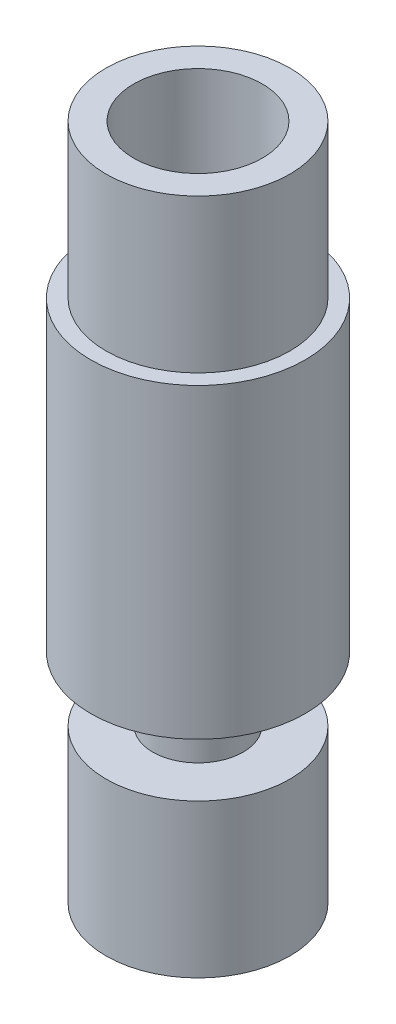
ISO-10303-21;
HEADER;
FILE_DESCRIPTION(('STEP AP214'),'2;1');
FILE_NAME('part.step','',(''),(''),'','','');
FILE_SCHEMA(('AUTOMOTIVE_DESIGN { 1 0 10303 214 1 1 1 1 }'));
ENDSEC;
DATA;
#1=APPLICATION_CONTEXT('core data for automotive mechanical design processes');
#2=APPLICATION_PROTOCOL_DEFINITION('international standard','automotive_design',2000,#1);
#3=PRODUCT_CONTEXT('',#1,'mechanical');
#4=PRODUCT('Part','Part','',(#3));
#5=PRODUCT_RELATED_PRODUCT_CATEGORY('part','',(#4));
#6=PRODUCT_DEFINITION_FORMATION('','',#4);
#7=PRODUCT_DEFINITION_CONTEXT('part definition',#1,'design');
#8=PRODUCT_DEFINITION('design','',#6,#7);
#9=PRODUCT_DEFINITION_SHAPE('','',#8);
#10=(LENGTH_UNIT() NAMED_UNIT(*) SI_UNIT(.MILLI.,.METRE.));
#11=(NAMED_UNIT(*) PLANE_ANGLE_UNIT() SI_UNIT($,.RADIAN.));
#12=(NAMED_UNIT(*) SI_UNIT($,.STERADIAN.) SOLID_ANGLE_UNIT());
#13=UNCERTAINTY_MEASURE_WITH_UNIT(LENGTH_MEASURE(1.E-05),#10,'distance_accuracy_value','');
#14=(GEOMETRIC_REPRESENTATION_CONTEXT(3) GLOBAL_UNCERTAINTY_ASSIGNED_CONTEXT((#13)) GLOBAL_UNIT_ASSIGNED_CONTEXT((#10,
#11,#12)) REPRESENTATION_CONTEXT('',''));
#15=CARTESIAN_POINT('',(0.,0.,0.));
#16=DIRECTION('',(0.,0.,1.));
#17=DIRECTION('',(1.,0.,0.));
#18=AXIS2_PLACEMENT_3D('',#15,#16,#17);
#19=CARTESIAN_POINT('',(3.,17.1,0.));
#20=DIRECTION('',(0.,1.,0.));
#21=DIRECTION('',(1.,0.,0.));
#22=AXIS2_PLACEMENT_3D('',#19,#20,#21);
#23=PLANE('',#22);
#24=CARTESIAN_POINT('',(0.,17.1,0.));
#25=DIRECTION('',(0.,-1.,0.));
#26=DIRECTION('',(0.,0.,-1.));
#27=AXIS2_PLACEMENT_3D('',#24,#25,#26);
#28=CIRCLE('',#27,3.);
#29=CARTESIAN_POINT('',(0.,17.1,3.));
#30=VERTEX_POINT('',#29);
#31=EDGE_CURVE('E68',#30,#30,#28,.T.);
#32=ORIENTED_EDGE('',*,*,#31,.T.);
#33=EDGE_LOOP('',(#32));
#34=FACE_BOUND('',#33,.T.);
#35=CARTESIAN_POINT('',(0.,17.1,0.));
#36=DIRECTION('',(0.,-1.,0.));
#37=DIRECTION('',(0.,0.,-1.));
#38=AXIS2_PLACEMENT_3D('',#35,#36,#37);
#39=CIRCLE('',#38,3.5);
#40=CARTESIAN_POINT('',(0.,17.1,3.5));
#41=VERTEX_POINT('',#40);
#42=EDGE_CURVE('E99',#41,#41,#39,.T.);
#43=ORIENTED_EDGE('',*,*,#42,.F.);
#44=EDGE_LOOP('',(#43));
#45=FACE_BOUND('',#44,.T.);
#46=ADVANCED_FACE('F17',(#34,#45),#23,.T.);
#47=CARTESIAN_POINT('',(3.5,7.1,0.));
#48=DIRECTION('',(0.,-1.,0.));
#49=DIRECTION('',(0.,0.,-1.));
#50=AXIS2_PLACEMENT_3D('',#47,#48,#49);
#51=PLANE('',#50);
#52=CARTESIAN_POINT('',(0.,7.1,0.));
#53=DIRECTION('',(0.,-1.,0.));
#54=DIRECTION('',(0.,0.,-1.));
#55=AXIS2_PLACEMENT_3D('',#52,#53,#54);
#56=CIRCLE('',#55,1.475);
#57=CARTESIAN_POINT('',(0.,7.1,1.475));
#58=VERTEX_POINT('',#57);
#59=EDGE_CURVE('E134',#58,#58,#56,.T.);
#60=ORIENTED_EDGE('',*,*,#59,.F.);
#61=EDGE_LOOP('',(#60));
#62=FACE_BOUND('',#61,.T.);
#63=CARTESIAN_POINT('',(0.,7.1,0.));
#64=DIRECTION('',(0.,-1.,0.));
#65=DIRECTION('',(0.,0.,-1.));
#66=AXIS2_PLACEMENT_3D('',#63,#64,#65);
#67=CIRCLE('',#66,3.5);
#68=CARTESIAN_POINT('',(0.,7.1,3.5));
#69=VERTEX_POINT('',#68);
#70=EDGE_CURVE('E113',#69,#69,#67,.T.);
#71=ORIENTED_EDGE('',*,*,#70,.T.);
#72=EDGE_LOOP('',(#71));
#73=FACE_BOUND('',#72,.T.);
#74=ADVANCED_FACE('F94',(#62,#73),#51,.T.);
#75=CARTESIAN_POINT('',(1.475,5.,0.));
#76=DIRECTION('',(0.,1.,0.));
#77=DIRECTION('',(1.,0.,0.));
#78=AXIS2_PLACEMENT_3D('',#75,#76,#77);
#79=PLANE('',#78);
#80=CARTESIAN_POINT('',(0.,5.,0.));
#81=DIRECTION('',(0.,-1.,0.));
#82=DIRECTION('',(0.,0.,-1.));
#83=AXIS2_PLACEMENT_3D('',#80,#81,#82);
#84=CIRCLE('',#83,1.475);
#85=CARTESIAN_POINT('',(0.,5.,1.475));
#86=VERTEX_POINT('',#85);
#87=EDGE_CURVE('E107',#86,#86,#84,.T.);
#88=ORIENTED_EDGE('',*,*,#87,.T.);
#89=EDGE_LOOP('',(#88));
#90=FACE_BOUND('',#89,.T.);
#91=CARTESIAN_POINT('',(0.,5.,0.));
#92=DIRECTION('',(0.,-1.,0.));
#93=DIRECTION('',(0.,0.,-1.));
#94=AXIS2_PLACEMENT_3D('',#91,#92,#93);
#95=CIRCLE('',#94,3.);
#96=CARTESIAN_POINT('',(0.,5.,3.));
#97=VERTEX_POINT('',#96);
#98=EDGE_CURVE('E126',#97,#97,#95,.T.);
#99=ORIENTED_EDGE('',*,*,#98,.F.);
#100=EDGE_LOOP('',(#99));
#101=FACE_BOUND('',#100,.T.);
#102=ADVANCED_FACE('F19',(#90,#101),#79,.T.);
#103=CARTESIAN_POINT('',(3.,0.,0.));
#104=DIRECTION('',(0.,-1.,0.));
#105=DIRECTION('',(0.,0.,-1.));
#106=AXIS2_PLACEMENT_3D('',#103,#104,#105);
#107=PLANE('',#106);
#108=CARTESIAN_POINT('',(0.,0.,0.));
#109=DIRECTION('',(0.,-1.,0.));
#110=DIRECTION('',(0.,0.,-1.));
#111=AXIS2_PLACEMENT_3D('',#108,#109,#110);
#112=CIRCLE('',#111,1.);
#113=CARTESIAN_POINT('',(0.,0.,1.));
#114=VERTEX_POINT('',#113);
#115=EDGE_CURVE('E152',#114,#114,#112,.T.);
#116=ORIENTED_EDGE('',*,*,#115,.F.);
#117=EDGE_LOOP('',(#116));
#118=FACE_BOUND('',#117,.T.);
#119=CARTESIAN_POINT('',(0.,0.,0.));
#120=DIRECTION('',(0.,-1.,0.));
#121=DIRECTION('',(0.,0.,-1.));
#122=AXIS2_PLACEMENT_3D('',#119,#120,#121);
#123=CIRCLE('',#122,3.);
#124=CARTESIAN_POINT('',(0.,0.,3.));
#125=VERTEX_POINT('',#124);
#126=EDGE_CURVE('E127',#125,#125,#123,.T.);
#127=ORIENTED_EDGE('',*,*,#126,.T.);
#128=EDGE_LOOP('',(#127));
#129=FACE_BOUND('',#128,.T.);
#130=ADVANCED_FACE('F199',(#118,#129),#107,.T.);
#131=CARTESIAN_POINT('',(2.1,22.1,0.));
#132=DIRECTION('',(0.,1.,0.));
#133=DIRECTION('',(1.,0.,0.));
#134=AXIS2_PLACEMENT_3D('',#131,#132,#133);
#135=PLANE('',#134);
#136=CARTESIAN_POINT('',(0.,22.1,0.));
#137=DIRECTION('',(0.,-1.,0.));
#138=DIRECTION('',(0.,0.,-1.));
#139=AXIS2_PLACEMENT_3D('',#136,#137,#138);
#140=CIRCLE('',#139,2.1);
#141=CARTESIAN_POINT('',(0.,22.1,2.1));
#142=VERTEX_POINT('',#141);
#143=EDGE_CURVE('E63',#142,#142,#140,.T.);
#144=ORIENTED_EDGE('',*,*,#143,.T.);
#145=EDGE_LOOP('',(#144));
#146=FACE_BOUND('',#145,.T.);
#147=CARTESIAN_POINT('',(0.,22.1,0.));
#148=DIRECTION('',(0.,-1.,0.));
#149=DIRECTION('',(0.,0.,-1.));
#150=AXIS2_PLACEMENT_3D('',#147,#148,#149);
#151=CIRCLE('',#150,3.);
#152=CARTESIAN_POINT('',(0.,22.1,3.));
#153=VERTEX_POINT('',#152);
#154=EDGE_CURVE('E11',#153,#153,#151,.T.);
#155=ORIENTED_EDGE('',*,*,#154,.F.);
#156=EDGE_LOOP('',(#155));
#157=FACE_BOUND('',#156,.T.);
#158=ADVANCED_FACE('F71',(#146,#157),#135,.T.);
#159=CARTESIAN_POINT('',(0.,0.,0.));
#160=DIRECTION('',(0.,-1.,0.));
#161=DIRECTION('',(0.,0.,-1.));
#162=AXIS2_PLACEMENT_3D('',#159,#160,#161);
#163=CYLINDRICAL_SURFACE('',#162,3.);
#164=ORIENTED_EDGE('',*,*,#31,.F.);
#165=DIRECTION('',(0.,1.,0.));
#166=VECTOR('',#165,1.);
#167=CARTESIAN_POINT('',(0.,0.,3.));
#168=LINE('',#167,#166);
#169=EDGE_CURVE('E27',#30,#153,#168,.T.);
#170=ORIENTED_EDGE('',*,*,#169,.T.);
#171=ORIENTED_EDGE('',*,*,#154,.T.);
#172=ORIENTED_EDGE('',*,*,#169,.F.);
#173=EDGE_LOOP('',(#164,#170,#171,#172));
#174=FACE_BOUND('',#173,.T.);
#175=ADVANCED_FACE('F90',(#174),#163,.T.);
#176=CARTESIAN_POINT('',(0.,0.,0.));
#177=DIRECTION('',(0.,-1.,0.));
#178=DIRECTION('',(0.,0.,-1.));
#179=AXIS2_PLACEMENT_3D('',#176,#177,#178);
#180=CYLINDRICAL_SURFACE('',#179,2.1);
#181=ORIENTED_EDGE('',*,*,#143,.F.);
#182=DIRECTION('',(0.,-1.,0.));
#183=VECTOR('',#182,1.);
#184=CARTESIAN_POINT('',(0.,0.,2.1));
#185=LINE('',#184,#183);
#186=CARTESIAN_POINT('',(0.,17.1,2.1));
#187=VERTEX_POINT('',#186);
#188=EDGE_CURVE('E60',#142,#187,#185,.T.);
#189=ORIENTED_EDGE('',*,*,#188,.T.);
#190=CARTESIAN_POINT('',(0.,17.1,0.));
#191=DIRECTION('',(0.,-1.,0.));
#192=DIRECTION('',(0.,0.,-1.));
#193=AXIS2_PLACEMENT_3D('',#190,#191,#192);
#194=CIRCLE('',#193,2.1);
#195=CARTESIAN_POINT('',(0.,17.1,-2.1));
#196=VERTEX_POINT('',#195);
#197=EDGE_CURVE('E80',#187,#196,#194,.T.);
#198=ORIENTED_EDGE('',*,*,#197,.T.);
#199=CARTESIAN_POINT('',(0.,17.1,0.));
#200=DIRECTION('',(0.,-1.,0.));
#201=DIRECTION('',(0.,0.,-1.));
#202=AXIS2_PLACEMENT_3D('',#199,#200,#201);
#203=CIRCLE('',#202,2.1);
#204=EDGE_CURVE('E65',#196,#187,#203,.T.);
#205=ORIENTED_EDGE('',*,*,#204,.T.);
#206=ORIENTED_EDGE('',*,*,#188,.F.);
#207=EDGE_LOOP('',(#181,#189,#198,#205,#206));
#208=FACE_BOUND('',#207,.T.);
#209=ADVANCED_FACE('F62',(#208),#180,.F.);
#210=CARTESIAN_POINT('',(0.,17.1,0.));
#211=DIRECTION('',(0.,1.,0.));
#212=DIRECTION('',(0.,0.,1.));
#213=AXIS2_PLACEMENT_3D('',#210,#211,#212);
#214=CONICAL_SURFACE('',#213,2.1,0.832981266674432);
#215=CARTESIAN_POINT('',(0.,16.1,0.));
#216=DIRECTION('',(0.,-1.,0.));
#217=DIRECTION('',(0.,0.,-1.));
#218=AXIS2_PLACEMENT_3D('',#215,#216,#217);
#219=CIRCLE('',#218,1.);
#220=CARTESIAN_POINT('',(0.,16.1,-1.));
#221=VERTEX_POINT('',#220);
#222=CARTESIAN_POINT('',(0.,16.1,1.));
#223=VERTEX_POINT('',#222);
#224=EDGE_CURVE('E142',#221,#223,#219,.T.);
#225=ORIENTED_EDGE('',*,*,#224,.T.);
#226=CARTESIAN_POINT('',(0.,16.1,0.));
#227=DIRECTION('',(0.,-1.,0.));
#228=DIRECTION('',(0.,0.,-1.));
#229=AXIS2_PLACEMENT_3D('',#226,#227,#228);
#230=CIRCLE('',#229,1.);
#231=EDGE_CURVE('E137',#223,#221,#230,.T.);
#232=ORIENTED_EDGE('',*,*,#231,.T.);
#233=DIRECTION('',(0.,0.672672793996313,-0.739940073395944));
#234=VECTOR('',#233,1.);
#235=CARTESIAN_POINT('',(0.,17.1,-2.1));
#236=LINE('',#235,#234);
#237=EDGE_CURVE('E149',#221,#196,#236,.T.);
#238=ORIENTED_EDGE('',*,*,#237,.T.);
#239=ORIENTED_EDGE('',*,*,#197,.F.);
#240=ORIENTED_EDGE('',*,*,#204,.F.);
#241=ORIENTED_EDGE('',*,*,#237,.F.);
#242=EDGE_LOOP('',(#225,#232,#238,#239,#240,#241));
#243=FACE_BOUND('',#242,.T.);
#244=ADVANCED_FACE('F163',(#243),#214,.F.);
#245=CARTESIAN_POINT('',(0.,0.,0.));
#246=DIRECTION('',(0.,-1.,0.));
#247=DIRECTION('',(0.,0.,-1.));
#248=AXIS2_PLACEMENT_3D('',#245,#246,#247);
#249=CYLINDRICAL_SURFACE('',#248,1.);
#250=ORIENTED_EDGE('',*,*,#224,.F.);
#251=ORIENTED_EDGE('',*,*,#231,.F.);
#252=DIRECTION('',(0.,-1.,0.));
#253=VECTOR('',#252,1.);
#254=CARTESIAN_POINT('',(0.,0.,1.));
#255=LINE('',#254,#253);
#256=EDGE_CURVE('E141',#223,#114,#255,.T.);
#257=ORIENTED_EDGE('',*,*,#256,.T.);
#258=ORIENTED_EDGE('',*,*,#115,.T.);
#259=ORIENTED_EDGE('',*,*,#256,.F.);
#260=EDGE_LOOP('',(#250,#251,#257,#258,#259));
#261=FACE_BOUND('',#260,.T.);
#262=ADVANCED_FACE('F216',(#261),#249,.F.);
#263=CARTESIAN_POINT('',(0.,0.,0.));
#264=DIRECTION('',(0.,-1.,0.));
#265=DIRECTION('',(0.,0.,-1.));
#266=AXIS2_PLACEMENT_3D('',#263,#264,#265);
#267=CYLINDRICAL_SURFACE('',#266,3.);
#268=ORIENTED_EDGE('',*,*,#126,.F.);
#269=DIRECTION('',(0.,1.,0.));
#270=VECTOR('',#269,1.);
#271=CARTESIAN_POINT('',(0.,0.,3.));
#272=LINE('',#271,#270);
#273=EDGE_CURVE('E122',#125,#97,#272,.T.);
#274=ORIENTED_EDGE('',*,*,#273,.T.);
#275=ORIENTED_EDGE('',*,*,#98,.T.);
#276=ORIENTED_EDGE('',*,*,#273,.F.);
#277=EDGE_LOOP('',(#268,#274,#275,#276));
#278=FACE_BOUND('',#277,.T.);
#279=ADVANCED_FACE('F196',(#278),#267,.T.);
#280=CARTESIAN_POINT('',(0.,0.,0.));
#281=DIRECTION('',(0.,-1.,0.));
#282=DIRECTION('',(0.,0.,-1.));
#283=AXIS2_PLACEMENT_3D('',#280,#281,#282);
#284=CYLINDRICAL_SURFACE('',#283,1.475);
#285=ORIENTED_EDGE('',*,*,#87,.F.);
#286=DIRECTION('',(0.,1.,0.));
#287=VECTOR('',#286,1.);
#288=CARTESIAN_POINT('',(0.,0.,1.475));
#289=LINE('',#288,#287);
#290=EDGE_CURVE('E129',#86,#58,#289,.T.);
#291=ORIENTED_EDGE('',*,*,#290,.T.);
#292=ORIENTED_EDGE('',*,*,#59,.T.);
#293=ORIENTED_EDGE('',*,*,#290,.F.);
#294=EDGE_LOOP('',(#285,#291,#292,#293));
#295=FACE_BOUND('',#294,.T.);
#296=ADVANCED_FACE('F215',(#295),#284,.T.);
#297=CARTESIAN_POINT('',(0.,0.,0.));
#298=DIRECTION('',(0.,-1.,0.));
#299=DIRECTION('',(0.,0.,-1.));
#300=AXIS2_PLACEMENT_3D('',#297,#298,#299);
#301=CYLINDRICAL_SURFACE('',#300,3.5);
#302=ORIENTED_EDGE('',*,*,#70,.F.);
#303=DIRECTION('',(0.,1.,0.));
#304=VECTOR('',#303,1.);
#305=CARTESIAN_POINT('',(0.,0.,3.5));
#306=LINE('',#305,#304);
#307=EDGE_CURVE('E108',#69,#41,#306,.T.);
#308=ORIENTED_EDGE('',*,*,#307,.T.);
#309=ORIENTED_EDGE('',*,*,#42,.T.);
#310=ORIENTED_EDGE('',*,*,#307,.F.);
#311=EDGE_LOOP('',(#302,#308,#309,#310));
#312=FACE_BOUND('',#311,.T.);
#313=ADVANCED_FACE('F111',(#312),#301,.T.);
#314=CLOSED_SHELL('',(#46,#74,#102,#130,#158,#175,#209,#244,#262,#279,#296,#313));
#315=MANIFOLD_SOLID_BREP('B1',#314);
#316=ADVANCED_BREP_SHAPE_REPRESENTATION('',(#18,#315),#14);
#317=SHAPE_DEFINITION_REPRESENTATION(#9,#316);
ENDSEC;
END-ISO-10303-21;
